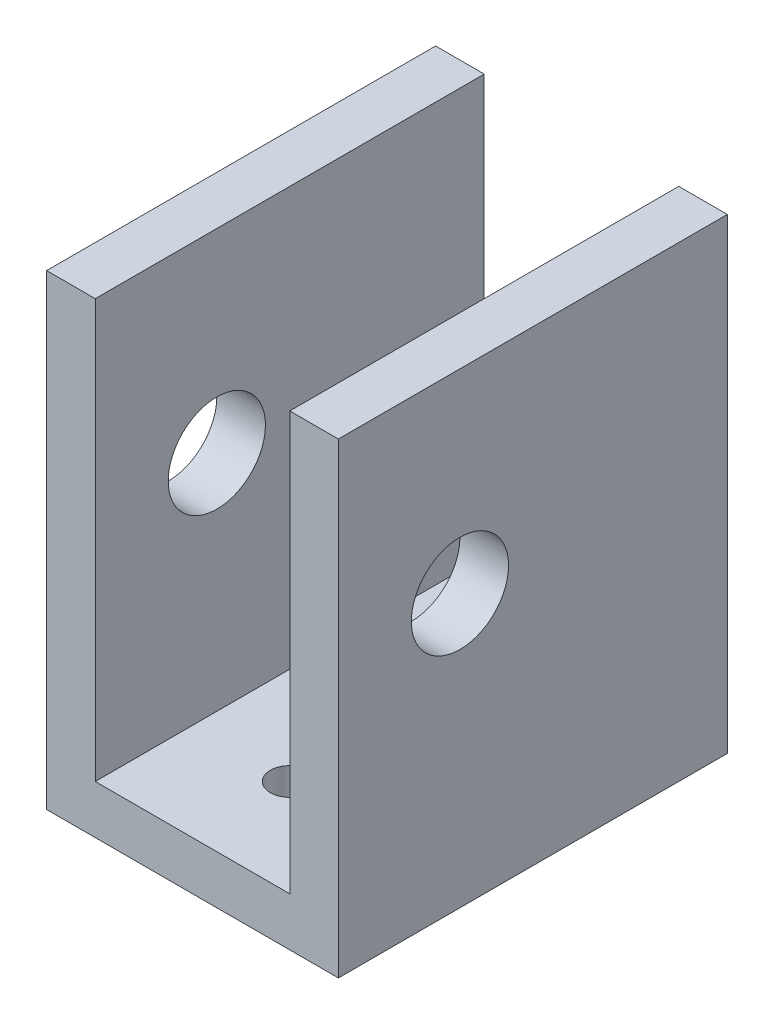
ISO-10303-21;
HEADER;
FILE_DESCRIPTION(('STEP AP214'),'2;1');
FILE_NAME('part.step','',(''),(''),'','','');
FILE_SCHEMA(('AUTOMOTIVE_DESIGN { 1 0 10303 214 1 1 1 1 }'));
ENDSEC;
DATA;
#1=APPLICATION_CONTEXT('core data for automotive mechanical design processes');
#2=APPLICATION_PROTOCOL_DEFINITION('international standard','automotive_design',2000,#1);
#3=PRODUCT_CONTEXT('',#1,'mechanical');
#4=PRODUCT('Part','Part','',(#3));
#5=PRODUCT_RELATED_PRODUCT_CATEGORY('part','',(#4));
#6=PRODUCT_DEFINITION_FORMATION('','',#4);
#7=PRODUCT_DEFINITION_CONTEXT('part definition',#1,'design');
#8=PRODUCT_DEFINITION('design','',#6,#7);
#9=PRODUCT_DEFINITION_SHAPE('','',#8);
#10=(LENGTH_UNIT() NAMED_UNIT(*) SI_UNIT(.MILLI.,.METRE.));
#11=(NAMED_UNIT(*) PLANE_ANGLE_UNIT() SI_UNIT($,.RADIAN.));
#12=(NAMED_UNIT(*) SI_UNIT($,.STERADIAN.) SOLID_ANGLE_UNIT());
#13=UNCERTAINTY_MEASURE_WITH_UNIT(LENGTH_MEASURE(1.E-05),#10,'distance_accuracy_value','');
#14=(GEOMETRIC_REPRESENTATION_CONTEXT(3) GLOBAL_UNCERTAINTY_ASSIGNED_CONTEXT((#13)) GLOBAL_UNIT_ASSIGNED_CONTEXT((#10,
#11,#12)) REPRESENTATION_CONTEXT('',''));
#15=CARTESIAN_POINT('',(0.,0.,0.));
#16=DIRECTION('',(0.,0.,1.));
#17=DIRECTION('',(1.,0.,0.));
#18=AXIS2_PLACEMENT_3D('',#15,#16,#17);
#19=CARTESIAN_POINT('',(0.,0.,12.7));
#20=DIRECTION('',(0.,0.,-1.));
#21=DIRECTION('',(-1.,0.,0.));
#22=AXIS2_PLACEMENT_3D('',#19,#20,#21);
#23=PLANE('',#22);
#24=DIRECTION('',(0.,1.,0.));
#25=VECTOR('',#24,1.);
#26=CARTESIAN_POINT('',(9.525,-19.05,12.7));
#27=LINE('',#26,#25);
#28=CARTESIAN_POINT('',(9.525,-19.05,12.7));
#29=VERTEX_POINT('',#28);
#30=CARTESIAN_POINT('',(9.525,11.43,12.7));
#31=VERTEX_POINT('',#30);
#32=EDGE_CURVE('E118',#29,#31,#27,.T.);
#33=ORIENTED_EDGE('',*,*,#32,.T.);
#34=DIRECTION('',(1.,0.,0.));
#35=VECTOR('',#34,1.);
#36=CARTESIAN_POINT('',(-9.525,11.43,12.7));
#37=LINE('',#36,#35);
#38=CARTESIAN_POINT('',(6.34999999999999,11.43,12.7));
#39=VERTEX_POINT('',#38);
#40=EDGE_CURVE('E103',#39,#31,#37,.T.);
#41=ORIENTED_EDGE('',*,*,#40,.F.);
#42=DIRECTION('',(0.,1.,0.));
#43=VECTOR('',#42,1.);
#44=CARTESIAN_POINT('',(6.35,-15.875,12.7));
#45=LINE('',#44,#43);
#46=CARTESIAN_POINT('',(6.35,-15.875,12.7));
#47=VERTEX_POINT('',#46);
#48=EDGE_CURVE('E171',#47,#39,#45,.T.);
#49=ORIENTED_EDGE('',*,*,#48,.F.);
#50=DIRECTION('',(1.,0.,0.));
#51=VECTOR('',#50,1.);
#52=CARTESIAN_POINT('',(-6.35,-15.875,12.7));
#53=LINE('',#52,#51);
#54=CARTESIAN_POINT('',(-6.35,-15.875,12.7));
#55=VERTEX_POINT('',#54);
#56=EDGE_CURVE('E176',#55,#47,#53,.T.);
#57=ORIENTED_EDGE('',*,*,#56,.F.);
#58=DIRECTION('',(0.,-1.,0.));
#59=VECTOR('',#58,1.);
#60=CARTESIAN_POINT('',(-6.35,-15.875,12.7));
#61=LINE('',#60,#59);
#62=CARTESIAN_POINT('',(-6.35,11.43,12.7));
#63=VERTEX_POINT('',#62);
#64=EDGE_CURVE('E112',#63,#55,#61,.T.);
#65=ORIENTED_EDGE('',*,*,#64,.F.);
#66=CARTESIAN_POINT('',(-9.525,11.43,12.7));
#67=VERTEX_POINT('',#66);
#68=EDGE_CURVE('E56',#67,#63,#37,.T.);
#69=ORIENTED_EDGE('',*,*,#68,.F.);
#70=DIRECTION('',(0.,-1.,0.));
#71=VECTOR('',#70,1.);
#72=CARTESIAN_POINT('',(-9.525,-19.05,12.7));
#73=LINE('',#72,#71);
#74=CARTESIAN_POINT('',(-9.525,-19.05,12.7));
#75=VERTEX_POINT('',#74);
#76=EDGE_CURVE('E109',#67,#75,#73,.T.);
#77=ORIENTED_EDGE('',*,*,#76,.T.);
#78=DIRECTION('',(1.,0.,0.));
#79=VECTOR('',#78,1.);
#80=CARTESIAN_POINT('',(-9.525,-19.05,12.7));
#81=LINE('',#80,#79);
#82=EDGE_CURVE('E117',#75,#29,#81,.T.);
#83=ORIENTED_EDGE('',*,*,#82,.T.);
#84=EDGE_LOOP('',(#33,#41,#49,#57,#65,#69,#77,#83));
#85=FACE_BOUND('',#84,.T.);
#86=ADVANCED_FACE('F32',(#85),#23,.F.);
#87=CARTESIAN_POINT('',(0.,0.,-12.7));
#88=DIRECTION('',(0.,0.,-1.));
#89=DIRECTION('',(-1.,0.,0.));
#90=AXIS2_PLACEMENT_3D('',#87,#88,#89);
#91=PLANE('',#90);
#92=DIRECTION('',(1.,0.,0.));
#93=VECTOR('',#92,1.);
#94=CARTESIAN_POINT('',(-9.525,11.43,-12.7));
#95=LINE('',#94,#93);
#96=CARTESIAN_POINT('',(6.35,11.43,-12.7));
#97=VERTEX_POINT('',#96);
#98=CARTESIAN_POINT('',(9.525,11.43,-12.7));
#99=VERTEX_POINT('',#98);
#100=EDGE_CURVE('E49',#97,#99,#95,.T.);
#101=ORIENTED_EDGE('',*,*,#100,.T.);
#102=DIRECTION('',(0.,1.,0.));
#103=VECTOR('',#102,1.);
#104=CARTESIAN_POINT('',(9.525,-19.05,-12.7));
#105=LINE('',#104,#103);
#106=CARTESIAN_POINT('',(9.525,-19.05,-12.7));
#107=VERTEX_POINT('',#106);
#108=EDGE_CURVE('E126',#107,#99,#105,.T.);
#109=ORIENTED_EDGE('',*,*,#108,.F.);
#110=DIRECTION('',(1.,0.,0.));
#111=VECTOR('',#110,1.);
#112=CARTESIAN_POINT('',(-9.525,-19.05,-12.7));
#113=LINE('',#112,#111);
#114=CARTESIAN_POINT('',(-9.525,-19.05,-12.7));
#115=VERTEX_POINT('',#114);
#116=EDGE_CURVE('E122',#115,#107,#113,.T.);
#117=ORIENTED_EDGE('',*,*,#116,.F.);
#118=DIRECTION('',(0.,-1.,0.));
#119=VECTOR('',#118,1.);
#120=CARTESIAN_POINT('',(-9.525,-19.05,-12.7));
#121=LINE('',#120,#119);
#122=CARTESIAN_POINT('',(-9.525,11.43,-12.7));
#123=VERTEX_POINT('',#122);
#124=EDGE_CURVE('E129',#123,#115,#121,.T.);
#125=ORIENTED_EDGE('',*,*,#124,.F.);
#126=CARTESIAN_POINT('',(-6.35,11.43,-12.7));
#127=VERTEX_POINT('',#126);
#128=EDGE_CURVE('E99',#123,#127,#95,.T.);
#129=ORIENTED_EDGE('',*,*,#128,.T.);
#130=DIRECTION('',(0.,-1.,0.));
#131=VECTOR('',#130,1.);
#132=CARTESIAN_POINT('',(-6.35,-15.875,-12.7));
#133=LINE('',#132,#131);
#134=CARTESIAN_POINT('',(-6.35,-15.875,-12.7));
#135=VERTEX_POINT('',#134);
#136=EDGE_CURVE('E181',#127,#135,#133,.T.);
#137=ORIENTED_EDGE('',*,*,#136,.T.);
#138=DIRECTION('',(1.,0.,0.));
#139=VECTOR('',#138,1.);
#140=CARTESIAN_POINT('',(-6.35,-15.875,-12.7));
#141=LINE('',#140,#139);
#142=CARTESIAN_POINT('',(6.35,-15.875,-12.7));
#143=VERTEX_POINT('',#142);
#144=EDGE_CURVE('E174',#135,#143,#141,.T.);
#145=ORIENTED_EDGE('',*,*,#144,.T.);
#146=DIRECTION('',(0.,1.,0.));
#147=VECTOR('',#146,1.);
#148=CARTESIAN_POINT('',(6.35,-15.875,-12.7));
#149=LINE('',#148,#147);
#150=EDGE_CURVE('E139',#143,#97,#149,.T.);
#151=ORIENTED_EDGE('',*,*,#150,.T.);
#152=EDGE_LOOP('',(#101,#109,#117,#125,#129,#137,#145,#151));
#153=FACE_BOUND('',#152,.T.);
#154=ADVANCED_FACE('F197',(#153),#91,.T.);
#155=CARTESIAN_POINT('',(9.525,-19.05,12.7));
#156=DIRECTION('',(-1.,0.,0.));
#157=DIRECTION('',(0.,0.,1.));
#158=AXIS2_PLACEMENT_3D('',#155,#156,#157);
#159=PLANE('',#158);
#160=CARTESIAN_POINT('',(9.525,-1.27,4.7625));
#161=DIRECTION('',(1.,0.,0.));
#162=DIRECTION('',(0.,0.,-1.));
#163=AXIS2_PLACEMENT_3D('',#160,#161,#162);
#164=CIRCLE('',#163,3.175);
#165=CARTESIAN_POINT('',(9.525,-1.27,1.5875));
#166=VERTEX_POINT('',#165);
#167=EDGE_CURVE('E162',#166,#166,#164,.T.);
#168=ORIENTED_EDGE('',*,*,#167,.F.);
#169=EDGE_LOOP('',(#168));
#170=FACE_BOUND('',#169,.T.);
#171=ORIENTED_EDGE('',*,*,#108,.T.);
#172=DIRECTION('',(0.,0.,-1.));
#173=VECTOR('',#172,1.);
#174=CARTESIAN_POINT('',(9.525,11.43,12.7));
#175=LINE('',#174,#173);
#176=EDGE_CURVE('E104',#31,#99,#175,.T.);
#177=ORIENTED_EDGE('',*,*,#176,.F.);
#178=ORIENTED_EDGE('',*,*,#32,.F.);
#179=DIRECTION('',(0.,0.,-1.));
#180=VECTOR('',#179,1.);
#181=CARTESIAN_POINT('',(9.525,-19.05,12.7));
#182=LINE('',#181,#180);
#183=EDGE_CURVE('E120',#29,#107,#182,.T.);
#184=ORIENTED_EDGE('',*,*,#183,.T.);
#185=EDGE_LOOP('',(#171,#177,#178,#184));
#186=FACE_BOUND('',#185,.T.);
#187=ADVANCED_FACE('F34',(#170,#186),#159,.F.);
#188=CARTESIAN_POINT('',(-9.525,-19.05,12.7));
#189=DIRECTION('',(1.,0.,0.));
#190=DIRECTION('',(0.,0.,-1.));
#191=AXIS2_PLACEMENT_3D('',#188,#189,#190);
#192=PLANE('',#191);
#193=CARTESIAN_POINT('',(-9.525,-1.27,4.7625));
#194=DIRECTION('',(1.,0.,0.));
#195=DIRECTION('',(0.,0.,-1.));
#196=AXIS2_PLACEMENT_3D('',#193,#194,#195);
#197=CIRCLE('',#196,3.175);
#198=CARTESIAN_POINT('',(-9.525,-1.27,1.5875));
#199=VERTEX_POINT('',#198);
#200=EDGE_CURVE('E144',#199,#199,#197,.T.);
#201=ORIENTED_EDGE('',*,*,#200,.T.);
#202=EDGE_LOOP('',(#201));
#203=FACE_BOUND('',#202,.T.);
#204=ORIENTED_EDGE('',*,*,#76,.F.);
#205=DIRECTION('',(0.,0.,-1.));
#206=VECTOR('',#205,1.);
#207=CARTESIAN_POINT('',(-9.525,11.43,12.7));
#208=LINE('',#207,#206);
#209=EDGE_CURVE('E96',#67,#123,#208,.T.);
#210=ORIENTED_EDGE('',*,*,#209,.T.);
#211=ORIENTED_EDGE('',*,*,#124,.T.);
#212=DIRECTION('',(0.,0.,-1.));
#213=VECTOR('',#212,1.);
#214=CARTESIAN_POINT('',(-9.525,-19.05,12.7));
#215=LINE('',#214,#213);
#216=EDGE_CURVE('E41',#75,#115,#215,.T.);
#217=ORIENTED_EDGE('',*,*,#216,.F.);
#218=EDGE_LOOP('',(#204,#210,#211,#217));
#219=FACE_BOUND('',#218,.T.);
#220=ADVANCED_FACE('F114',(#203,#219),#192,.F.);
#221=CARTESIAN_POINT('',(-9.525,-19.05,12.7));
#222=DIRECTION('',(0.,1.,0.));
#223=DIRECTION('',(0.,0.,1.));
#224=AXIS2_PLACEMENT_3D('',#221,#222,#223);
#225=PLANE('',#224);
#226=CARTESIAN_POINT('',(0.,-19.05,6.35));
#227=DIRECTION('',(0.,-1.,0.));
#228=DIRECTION('',(0.,0.,-1.));
#229=AXIS2_PLACEMENT_3D('',#226,#227,#228);
#230=CIRCLE('',#229,1.27);
#231=CARTESIAN_POINT('',(0.,-19.05,5.08));
#232=VERTEX_POINT('',#231);
#233=EDGE_CURVE('E156',#232,#232,#230,.T.);
#234=ORIENTED_EDGE('',*,*,#233,.F.);
#235=EDGE_LOOP('',(#234));
#236=FACE_BOUND('',#235,.T.);
#237=CARTESIAN_POINT('',(0.,-19.05,-6.35));
#238=DIRECTION('',(0.,-1.,0.));
#239=DIRECTION('',(0.,0.,-1.));
#240=AXIS2_PLACEMENT_3D('',#237,#238,#239);
#241=CIRCLE('',#240,1.27);
#242=CARTESIAN_POINT('',(0.,-19.05,-7.62));
#243=VERTEX_POINT('',#242);
#244=EDGE_CURVE('E147',#243,#243,#241,.T.);
#245=ORIENTED_EDGE('',*,*,#244,.F.);
#246=EDGE_LOOP('',(#245));
#247=FACE_BOUND('',#246,.T.);
#248=CARTESIAN_POINT('',(0.,-19.05,0.));
#249=DIRECTION('',(0.,-1.,0.));
#250=DIRECTION('',(0.,0.,-1.));
#251=AXIS2_PLACEMENT_3D('',#248,#249,#250);
#252=CIRCLE('',#251,2.54);
#253=CARTESIAN_POINT('',(0.,-19.05,-2.54));
#254=VERTEX_POINT('',#253);
#255=EDGE_CURVE('E140',#254,#254,#252,.T.);
#256=ORIENTED_EDGE('',*,*,#255,.F.);
#257=EDGE_LOOP('',(#256));
#258=FACE_BOUND('',#257,.T.);
#259=ORIENTED_EDGE('',*,*,#116,.T.);
#260=ORIENTED_EDGE('',*,*,#183,.F.);
#261=ORIENTED_EDGE('',*,*,#82,.F.);
#262=ORIENTED_EDGE('',*,*,#216,.T.);
#263=EDGE_LOOP('',(#259,#260,#261,#262));
#264=FACE_BOUND('',#263,.T.);
#265=ADVANCED_FACE('F201',(#236,#247,#258,#264),#225,.F.);
#266=CARTESIAN_POINT('',(6.35,-15.875,12.7));
#267=DIRECTION('',(-1.,0.,0.));
#268=DIRECTION('',(0.,0.,1.));
#269=AXIS2_PLACEMENT_3D('',#266,#267,#268);
#270=PLANE('',#269);
#271=DIRECTION('',(0.,0.,1.));
#272=VECTOR('',#271,1.);
#273=CARTESIAN_POINT('',(6.35,11.43,12.7));
#274=LINE('',#273,#272);
#275=EDGE_CURVE('E159',#97,#39,#274,.T.);
#276=ORIENTED_EDGE('',*,*,#275,.F.);
#277=ORIENTED_EDGE('',*,*,#150,.F.);
#278=DIRECTION('',(0.,0.,-1.));
#279=VECTOR('',#278,1.);
#280=CARTESIAN_POINT('',(6.35,-15.875,12.7));
#281=LINE('',#280,#279);
#282=EDGE_CURVE('E178',#47,#143,#281,.T.);
#283=ORIENTED_EDGE('',*,*,#282,.F.);
#284=ORIENTED_EDGE('',*,*,#48,.T.);
#285=EDGE_LOOP('',(#276,#277,#283,#284));
#286=FACE_BOUND('',#285,.T.);
#287=CARTESIAN_POINT('',(6.35,-1.27,4.7625));
#288=DIRECTION('',(-1.,0.,0.));
#289=DIRECTION('',(0.,0.,1.));
#290=AXIS2_PLACEMENT_3D('',#287,#288,#289);
#291=CIRCLE('',#290,3.175);
#292=CARTESIAN_POINT('',(6.35,-1.27,1.5875));
#293=VERTEX_POINT('',#292);
#294=EDGE_CURVE('E143',#293,#293,#291,.T.);
#295=ORIENTED_EDGE('',*,*,#294,.F.);
#296=EDGE_LOOP('',(#295));
#297=FACE_BOUND('',#296,.T.);
#298=ADVANCED_FACE('F210',(#286,#297),#270,.T.);
#299=CARTESIAN_POINT('',(-6.35,-15.875,12.7));
#300=DIRECTION('',(1.,0.,0.));
#301=DIRECTION('',(0.,0.,-1.));
#302=AXIS2_PLACEMENT_3D('',#299,#300,#301);
#303=PLANE('',#302);
#304=DIRECTION('',(0.,0.,-1.));
#305=VECTOR('',#304,1.);
#306=CARTESIAN_POINT('',(-6.35,11.43,12.7));
#307=LINE('',#306,#305);
#308=EDGE_CURVE('E11',#63,#127,#307,.T.);
#309=ORIENTED_EDGE('',*,*,#308,.F.);
#310=ORIENTED_EDGE('',*,*,#64,.T.);
#311=DIRECTION('',(0.,0.,-1.));
#312=VECTOR('',#311,1.);
#313=CARTESIAN_POINT('',(-6.35,-15.875,12.7));
#314=LINE('',#313,#312);
#315=EDGE_CURVE('E130',#55,#135,#314,.T.);
#316=ORIENTED_EDGE('',*,*,#315,.T.);
#317=ORIENTED_EDGE('',*,*,#136,.F.);
#318=EDGE_LOOP('',(#309,#310,#316,#317));
#319=FACE_BOUND('',#318,.T.);
#320=CARTESIAN_POINT('',(-6.35,-1.27,4.7625));
#321=DIRECTION('',(1.,0.,0.));
#322=DIRECTION('',(0.,0.,-1.));
#323=AXIS2_PLACEMENT_3D('',#320,#321,#322);
#324=CIRCLE('',#323,3.175);
#325=CARTESIAN_POINT('',(-6.35,-1.27,1.5875));
#326=VERTEX_POINT('',#325);
#327=EDGE_CURVE('E141',#326,#326,#324,.T.);
#328=ORIENTED_EDGE('',*,*,#327,.F.);
#329=EDGE_LOOP('',(#328));
#330=FACE_BOUND('',#329,.T.);
#331=ADVANCED_FACE('F191',(#319,#330),#303,.T.);
#332=CARTESIAN_POINT('',(-6.35,-15.875,12.7));
#333=DIRECTION('',(0.,1.,0.));
#334=DIRECTION('',(0.,0.,1.));
#335=AXIS2_PLACEMENT_3D('',#332,#333,#334);
#336=PLANE('',#335);
#337=CARTESIAN_POINT('',(0.,-15.875,6.35));
#338=DIRECTION('',(0.,1.,0.));
#339=DIRECTION('',(0.,0.,1.));
#340=AXIS2_PLACEMENT_3D('',#337,#338,#339);
#341=CIRCLE('',#340,1.27);
#342=CARTESIAN_POINT('',(0.,-15.875,5.08));
#343=VERTEX_POINT('',#342);
#344=EDGE_CURVE('E36',#343,#343,#341,.T.);
#345=ORIENTED_EDGE('',*,*,#344,.F.);
#346=EDGE_LOOP('',(#345));
#347=FACE_BOUND('',#346,.T.);
#348=CARTESIAN_POINT('',(0.,-15.875,-6.35));
#349=DIRECTION('',(0.,1.,0.));
#350=DIRECTION('',(0.,0.,1.));
#351=AXIS2_PLACEMENT_3D('',#348,#349,#350);
#352=CIRCLE('',#351,1.27);
#353=CARTESIAN_POINT('',(0.,-15.875,-7.62));
#354=VERTEX_POINT('',#353);
#355=EDGE_CURVE('E145',#354,#354,#352,.T.);
#356=ORIENTED_EDGE('',*,*,#355,.F.);
#357=EDGE_LOOP('',(#356));
#358=FACE_BOUND('',#357,.T.);
#359=CARTESIAN_POINT('',(0.,-15.875,0.));
#360=DIRECTION('',(0.,1.,0.));
#361=DIRECTION('',(0.,0.,1.));
#362=AXIS2_PLACEMENT_3D('',#359,#360,#361);
#363=CIRCLE('',#362,2.54);
#364=CARTESIAN_POINT('',(0.,-15.875,-2.54));
#365=VERTEX_POINT('',#364);
#366=EDGE_CURVE('E136',#365,#365,#363,.T.);
#367=ORIENTED_EDGE('',*,*,#366,.F.);
#368=EDGE_LOOP('',(#367));
#369=FACE_BOUND('',#368,.T.);
#370=ORIENTED_EDGE('',*,*,#144,.F.);
#371=ORIENTED_EDGE('',*,*,#315,.F.);
#372=ORIENTED_EDGE('',*,*,#56,.T.);
#373=ORIENTED_EDGE('',*,*,#282,.T.);
#374=EDGE_LOOP('',(#370,#371,#372,#373));
#375=FACE_BOUND('',#374,.T.);
#376=ADVANCED_FACE('F194',(#347,#358,#369,#375),#336,.T.);
#377=CARTESIAN_POINT('',(0.,57.15,0.));
#378=DIRECTION('',(0.,-1.,0.));
#379=DIRECTION('',(0.,0.,-1.));
#380=AXIS2_PLACEMENT_3D('',#377,#378,#379);
#381=CYLINDRICAL_SURFACE('',#380,2.54);
#382=CARTESIAN_POINT('',(0.,-15.875,-2.54));
#383=CARTESIAN_POINT('',(0.,-15.9080729166667,-2.54));
#384=CARTESIAN_POINT('',(0.,-15.9411458333334,-2.54));
#385=CARTESIAN_POINT('',(0.,-16.0072916666667,-2.54));
#386=CARTESIAN_POINT('',(0.,-16.0403645833333,-2.54));
#387=CARTESIAN_POINT('',(0.,-16.1065104166667,-2.54));
#388=CARTESIAN_POINT('',(0.,-16.1395833333333,-2.54));
#389=CARTESIAN_POINT('',(0.,-16.2057291666667,-2.54));
#390=CARTESIAN_POINT('',(0.,-16.2388020833333,-2.54));
#391=CARTESIAN_POINT('',(0.,-16.3049479166667,-2.54));
#392=CARTESIAN_POINT('',(0.,-16.3380208333333,-2.54));
#393=CARTESIAN_POINT('',(0.,-16.4041666666667,-2.54));
#394=CARTESIAN_POINT('',(0.,-16.4372395833333,-2.54));
#395=CARTESIAN_POINT('',(0.,-16.5033854166667,-2.54));
#396=CARTESIAN_POINT('',(0.,-16.5364583333333,-2.54));
#397=CARTESIAN_POINT('',(0.,-16.6026041666667,-2.54));
#398=CARTESIAN_POINT('',(0.,-16.6356770833333,-2.54));
#399=CARTESIAN_POINT('',(0.,-16.7018229166667,-2.54));
#400=CARTESIAN_POINT('',(0.,-16.7348958333333,-2.54));
#401=CARTESIAN_POINT('',(0.,-16.8010416666667,-2.54));
#402=CARTESIAN_POINT('',(0.,-16.8341145833333,-2.54));
#403=CARTESIAN_POINT('',(0.,-16.9002604166667,-2.54));
#404=CARTESIAN_POINT('',(0.,-16.9333333333333,-2.54));
#405=CARTESIAN_POINT('',(0.,-16.9994791666667,-2.54));
#406=CARTESIAN_POINT('',(0.,-17.0325520833333,-2.54));
#407=CARTESIAN_POINT('',(0.,-17.0986979166667,-2.54));
#408=CARTESIAN_POINT('',(0.,-17.1317708333333,-2.54));
#409=CARTESIAN_POINT('',(0.,-17.1979166666667,-2.54));
#410=CARTESIAN_POINT('',(0.,-17.2309895833333,-2.54));
#411=CARTESIAN_POINT('',(0.,-17.2971354166667,-2.54));
#412=CARTESIAN_POINT('',(0.,-17.3302083333333,-2.54));
#413=CARTESIAN_POINT('',(0.,-17.3963541666667,-2.54));
#414=CARTESIAN_POINT('',(0.,-17.4294270833333,-2.54));
#415=CARTESIAN_POINT('',(0.,-17.4955729166667,-2.54));
#416=CARTESIAN_POINT('',(0.,-17.5286458333333,-2.54));
#417=CARTESIAN_POINT('',(0.,-17.5947916666667,-2.54));
#418=CARTESIAN_POINT('',(0.,-17.6278645833333,-2.54));
#419=CARTESIAN_POINT('',(0.,-17.6940104166667,-2.54));
#420=CARTESIAN_POINT('',(0.,-17.7270833333333,-2.54));
#421=CARTESIAN_POINT('',(0.,-17.7932291666667,-2.54));
#422=CARTESIAN_POINT('',(0.,-17.8263020833333,-2.54));
#423=CARTESIAN_POINT('',(0.,-17.8924479166667,-2.54));
#424=CARTESIAN_POINT('',(0.,-17.9255208333333,-2.54));
#425=CARTESIAN_POINT('',(0.,-17.9916666666667,-2.54));
#426=CARTESIAN_POINT('',(0.,-18.0247395833333,-2.54));
#427=CARTESIAN_POINT('',(0.,-18.0908854166667,-2.54));
#428=CARTESIAN_POINT('',(0.,-18.1239583333333,-2.54));
#429=CARTESIAN_POINT('',(0.,-18.1901041666667,-2.54));
#430=CARTESIAN_POINT('',(0.,-18.2231770833333,-2.54));
#431=CARTESIAN_POINT('',(0.,-18.2893229166667,-2.54));
#432=CARTESIAN_POINT('',(0.,-18.3223958333333,-2.54));
#433=CARTESIAN_POINT('',(0.,-18.3885416666667,-2.54));
#434=CARTESIAN_POINT('',(0.,-18.4216145833333,-2.54));
#435=CARTESIAN_POINT('',(0.,-18.4877604166667,-2.54));
#436=CARTESIAN_POINT('',(0.,-18.5208333333333,-2.54));
#437=CARTESIAN_POINT('',(0.,-18.5869791666667,-2.54));
#438=CARTESIAN_POINT('',(0.,-18.6200520833333,-2.54));
#439=CARTESIAN_POINT('',(0.,-18.6861979166667,-2.54));
#440=CARTESIAN_POINT('',(0.,-18.7192708333333,-2.54));
#441=CARTESIAN_POINT('',(0.,-18.7854166666667,-2.54));
#442=CARTESIAN_POINT('',(0.,-18.8184895833333,-2.54));
#443=CARTESIAN_POINT('',(0.,-18.8846354166667,-2.54));
#444=CARTESIAN_POINT('',(0.,-18.9177083333333,-2.54));
#445=CARTESIAN_POINT('',(0.,-18.9838541666667,-2.54));
#446=CARTESIAN_POINT('',(0.,-19.0169270833333,-2.54));
#447=CARTESIAN_POINT('',(0.,-19.05,-2.54));
#448=B_SPLINE_CURVE_WITH_KNOTS('',3,(#382,#383,#384,#385,#386,#387,#388,#389,#390,#391,#392,
#393,#394,#395,#396,#397,#398,#399,#400,#401,#402,#403,#404,#405,#406,#407,#408,#409,#410,#411,
#412,#413,#414,#415,#416,#417,#418,#419,#420,#421,#422,#423,#424,#425,#426,#427,#428,#429,#430,
#431,#432,#433,#434,#435,#436,#437,#438,#439,#440,#441,#442,#443,#444,#445,#446,#447),
.UNSPECIFIED.,.F.,.F.,(4,2,2,2,2,2,2,2,2,2,2,2,2,2,2,2,2,2,2,2,2,2,2,2,2,2,2,2,2,2,2,2,4),(0.,
0.0992187500000047,0.198437499999995,0.29765625,0.396874999999991,0.496093749999996,0.5953125,
0.694531249999991,0.793749999999996,0.892968750000001,0.992187499999991,1.09140625,1.190625,
1.28984374999999,1.3890625,1.48828124999999,1.58749999999999,1.68671875,1.78593749999999,
1.88515624999999,1.98437499999998,2.08359374999999,2.18281249999999,2.28203124999998,
2.38124999999999,2.48046874999999,2.57968749999998,2.67890624999999,2.77812499999999,
2.87734374999998,2.97656249999999,3.07578124999998,3.17499999999998),.UNSPECIFIED.);
#449=EDGE_CURVE('BSEAM246',#365,#254,#448,.T.);
#450=ORIENTED_EDGE('',*,*,#366,.T.);
#451=ORIENTED_EDGE('',*,*,#255,.T.);
#452=ORIENTED_EDGE('',*,*,#449,.T.);
#453=ORIENTED_EDGE('',*,*,#449,.F.);
#454=EDGE_LOOP('',(#450,#452,#451,#453));
#455=FACE_BOUND('',#454,.T.);
#456=ADVANCED_FACE('F246',(#455),#381,.F.);
#457=CARTESIAN_POINT('',(-9.525,-1.27,4.7625));
#458=DIRECTION('',(1.,0.,0.));
#459=DIRECTION('',(0.,0.,-1.));
#460=AXIS2_PLACEMENT_3D('',#457,#458,#459);
#461=CYLINDRICAL_SURFACE('',#460,3.175);
#462=CARTESIAN_POINT('',(-6.35,-1.27,1.5875));
#463=CARTESIAN_POINT('',(-6.38307291666667,-1.27,1.5875));
#464=CARTESIAN_POINT('',(-6.41614583333333,-1.27,1.5875));
#465=CARTESIAN_POINT('',(-6.48229166666667,-1.27,1.5875));
#466=CARTESIAN_POINT('',(-6.51536458333334,-1.27,1.5875));
#467=CARTESIAN_POINT('',(-6.58151041666667,-1.27,1.5875));
#468=CARTESIAN_POINT('',(-6.61458333333333,-1.27,1.5875));
#469=CARTESIAN_POINT('',(-6.68072916666667,-1.27,1.5875));
#470=CARTESIAN_POINT('',(-6.71380208333333,-1.27,1.5875));
#471=CARTESIAN_POINT('',(-6.77994791666667,-1.27,1.5875));
#472=CARTESIAN_POINT('',(-6.81302083333333,-1.27,1.5875));
#473=CARTESIAN_POINT('',(-6.87916666666667,-1.27,1.5875));
#474=CARTESIAN_POINT('',(-6.91223958333333,-1.27,1.5875));
#475=CARTESIAN_POINT('',(-6.97838541666667,-1.27,1.5875));
#476=CARTESIAN_POINT('',(-7.01145833333333,-1.27,1.5875));
#477=CARTESIAN_POINT('',(-7.07760416666667,-1.27,1.5875));
#478=CARTESIAN_POINT('',(-7.11067708333333,-1.27,1.5875));
#479=CARTESIAN_POINT('',(-7.17682291666667,-1.27,1.5875));
#480=CARTESIAN_POINT('',(-7.20989583333333,-1.27,1.5875));
#481=CARTESIAN_POINT('',(-7.27604166666667,-1.27,1.5875));
#482=CARTESIAN_POINT('',(-7.30911458333333,-1.27,1.5875));
#483=CARTESIAN_POINT('',(-7.37526041666667,-1.27,1.5875));
#484=CARTESIAN_POINT('',(-7.40833333333333,-1.27,1.5875));
#485=CARTESIAN_POINT('',(-7.47447916666667,-1.27,1.5875));
#486=CARTESIAN_POINT('',(-7.50755208333333,-1.27,1.5875));
#487=CARTESIAN_POINT('',(-7.57369791666667,-1.27,1.5875));
#488=CARTESIAN_POINT('',(-7.60677083333333,-1.27,1.5875));
#489=CARTESIAN_POINT('',(-7.67291666666667,-1.27,1.5875));
#490=CARTESIAN_POINT('',(-7.70598958333333,-1.27,1.5875));
#491=CARTESIAN_POINT('',(-7.77213541666667,-1.27,1.5875));
#492=CARTESIAN_POINT('',(-7.80520833333333,-1.27,1.5875));
#493=CARTESIAN_POINT('',(-7.87135416666667,-1.27,1.5875));
#494=CARTESIAN_POINT('',(-7.90442708333333,-1.27,1.5875));
#495=CARTESIAN_POINT('',(-7.97057291666667,-1.27,1.5875));
#496=CARTESIAN_POINT('',(-8.00364583333334,-1.27,1.5875));
#497=CARTESIAN_POINT('',(-8.06979166666667,-1.27,1.5875));
#498=CARTESIAN_POINT('',(-8.10286458333333,-1.27,1.5875));
#499=CARTESIAN_POINT('',(-8.16901041666667,-1.27,1.5875));
#500=CARTESIAN_POINT('',(-8.20208333333333,-1.27,1.5875));
#501=CARTESIAN_POINT('',(-8.26822916666667,-1.27,1.5875));
#502=CARTESIAN_POINT('',(-8.30130208333333,-1.27,1.5875));
#503=CARTESIAN_POINT('',(-8.36744791666667,-1.27,1.5875));
#504=CARTESIAN_POINT('',(-8.40052083333333,-1.27,1.5875));
#505=CARTESIAN_POINT('',(-8.46666666666667,-1.27,1.5875));
#506=CARTESIAN_POINT('',(-8.49973958333333,-1.27,1.5875));
#507=CARTESIAN_POINT('',(-8.56588541666667,-1.27,1.5875));
#508=CARTESIAN_POINT('',(-8.59895833333333,-1.27,1.5875));
#509=CARTESIAN_POINT('',(-8.66510416666667,-1.27,1.5875));
#510=CARTESIAN_POINT('',(-8.69817708333333,-1.27,1.5875));
#511=CARTESIAN_POINT('',(-8.76432291666667,-1.27,1.5875));
#512=CARTESIAN_POINT('',(-8.79739583333333,-1.27,1.5875));
#513=CARTESIAN_POINT('',(-8.86354166666667,-1.27,1.5875));
#514=CARTESIAN_POINT('',(-8.89661458333333,-1.27,1.5875));
#515=CARTESIAN_POINT('',(-8.96276041666667,-1.27,1.5875));
#516=CARTESIAN_POINT('',(-8.99583333333333,-1.27,1.5875));
#517=CARTESIAN_POINT('',(-9.06197916666667,-1.27,1.5875));
#518=CARTESIAN_POINT('',(-9.09505208333333,-1.27,1.5875));
#519=CARTESIAN_POINT('',(-9.16119791666667,-1.27,1.5875));
#520=CARTESIAN_POINT('',(-9.19427083333333,-1.27,1.5875));
#521=CARTESIAN_POINT('',(-9.26041666666667,-1.27,1.5875));
#522=CARTESIAN_POINT('',(-9.29348958333333,-1.27,1.5875));
#523=CARTESIAN_POINT('',(-9.35963541666667,-1.27,1.5875));
#524=CARTESIAN_POINT('',(-9.39270833333333,-1.27,1.5875));
#525=CARTESIAN_POINT('',(-9.45885416666667,-1.27,1.5875));
#526=CARTESIAN_POINT('',(-9.49192708333333,-1.27,1.5875));
#527=CARTESIAN_POINT('',(-9.525,-1.27,1.5875));
#528=B_SPLINE_CURVE_WITH_KNOTS('',3,(#462,#463,#464,#465,#466,#467,#468,#469,#470,#471,#472,
#473,#474,#475,#476,#477,#478,#479,#480,#481,#482,#483,#484,#485,#486,#487,#488,#489,#490,#491,
#492,#493,#494,#495,#496,#497,#498,#499,#500,#501,#502,#503,#504,#505,#506,#507,#508,#509,#510,
#511,#512,#513,#514,#515,#516,#517,#518,#519,#520,#521,#522,#523,#524,#525,#526,#527),
.UNSPECIFIED.,.F.,.F.,(4,2,2,2,2,2,2,2,2,2,2,2,2,2,2,2,2,2,2,2,2,2,2,2,2,2,2,2,2,2,2,2,4),(0.,
0.0992187500000004,0.198437500000001,0.29765625,0.396875,0.49609375,0.5953125,0.69453125,
0.793749999999999,0.892968750000001,0.9921875,1.09140625,1.190625,1.28984375,1.3890625,
1.48828125,1.5875,1.68671875,1.7859375,1.88515625,1.984375,2.08359375,2.1828125,2.28203125,
2.38125,2.48046875,2.5796875,2.67890625,2.778125,2.87734375,2.9765625,3.07578125,3.175),.UNSPECIFIED.);
#529=EDGE_CURVE('BSEAM219',#326,#199,#528,.T.);
#530=ORIENTED_EDGE('',*,*,#327,.T.);
#531=ORIENTED_EDGE('',*,*,#200,.F.);
#532=ORIENTED_EDGE('',*,*,#529,.T.);
#533=ORIENTED_EDGE('',*,*,#529,.F.);
#534=EDGE_LOOP('',(#530,#532,#531,#533));
#535=FACE_BOUND('',#534,.T.);
#536=ADVANCED_FACE('F219',(#535),#461,.F.);
#537=CARTESIAN_POINT('',(6.35,-1.27,1.5875));
#538=CARTESIAN_POINT('',(6.38307291666667,-1.27,1.5875));
#539=CARTESIAN_POINT('',(6.41614583333333,-1.27,1.5875));
#540=CARTESIAN_POINT('',(6.48229166666667,-1.27,1.5875));
#541=CARTESIAN_POINT('',(6.51536458333333,-1.27,1.5875));
#542=CARTESIAN_POINT('',(6.58151041666666,-1.27,1.5875));
#543=CARTESIAN_POINT('',(6.61458333333333,-1.27,1.5875));
#544=CARTESIAN_POINT('',(6.68072916666667,-1.27,1.5875));
#545=CARTESIAN_POINT('',(6.71380208333333,-1.27,1.5875));
#546=CARTESIAN_POINT('',(6.77994791666667,-1.27,1.5875));
#547=CARTESIAN_POINT('',(6.81302083333333,-1.27,1.5875));
#548=CARTESIAN_POINT('',(6.87916666666666,-1.27,1.5875));
#549=CARTESIAN_POINT('',(6.91223958333333,-1.27,1.5875));
#550=CARTESIAN_POINT('',(6.97838541666667,-1.27,1.5875));
#551=CARTESIAN_POINT('',(7.01145833333333,-1.27,1.5875));
#552=CARTESIAN_POINT('',(7.07760416666667,-1.27,1.5875));
#553=CARTESIAN_POINT('',(7.11067708333333,-1.27,1.5875));
#554=CARTESIAN_POINT('',(7.17682291666667,-1.27,1.5875));
#555=CARTESIAN_POINT('',(7.20989583333333,-1.27,1.5875));
#556=CARTESIAN_POINT('',(7.27604166666667,-1.27,1.5875));
#557=CARTESIAN_POINT('',(7.30911458333333,-1.27,1.5875));
#558=CARTESIAN_POINT('',(7.37526041666667,-1.27,1.5875));
#559=CARTESIAN_POINT('',(7.40833333333333,-1.27,1.5875));
#560=CARTESIAN_POINT('',(7.47447916666667,-1.27,1.5875));
#561=CARTESIAN_POINT('',(7.50755208333333,-1.27,1.5875));
#562=CARTESIAN_POINT('',(7.57369791666667,-1.27,1.5875));
#563=CARTESIAN_POINT('',(7.60677083333333,-1.27,1.5875));
#564=CARTESIAN_POINT('',(7.67291666666667,-1.27,1.5875));
#565=CARTESIAN_POINT('',(7.70598958333333,-1.27,1.5875));
#566=CARTESIAN_POINT('',(7.77213541666667,-1.27,1.5875));
#567=CARTESIAN_POINT('',(7.80520833333333,-1.27,1.5875));
#568=CARTESIAN_POINT('',(7.87135416666667,-1.27,1.5875));
#569=CARTESIAN_POINT('',(7.90442708333333,-1.27,1.5875));
#570=CARTESIAN_POINT('',(7.97057291666667,-1.27,1.5875));
#571=CARTESIAN_POINT('',(8.00364583333334,-1.27,1.5875));
#572=CARTESIAN_POINT('',(8.06979166666667,-1.27,1.5875));
#573=CARTESIAN_POINT('',(8.10286458333333,-1.27,1.5875));
#574=CARTESIAN_POINT('',(8.16901041666667,-1.27,1.5875));
#575=CARTESIAN_POINT('',(8.20208333333333,-1.27,1.5875));
#576=CARTESIAN_POINT('',(8.26822916666667,-1.27,1.5875));
#577=CARTESIAN_POINT('',(8.30130208333333,-1.27,1.5875));
#578=CARTESIAN_POINT('',(8.36744791666667,-1.27,1.5875));
#579=CARTESIAN_POINT('',(8.40052083333333,-1.27,1.5875));
#580=CARTESIAN_POINT('',(8.46666666666667,-1.27,1.5875));
#581=CARTESIAN_POINT('',(8.49973958333333,-1.27,1.5875));
#582=CARTESIAN_POINT('',(8.56588541666667,-1.27,1.5875));
#583=CARTESIAN_POINT('',(8.59895833333334,-1.27,1.5875));
#584=CARTESIAN_POINT('',(8.66510416666667,-1.27,1.5875));
#585=CARTESIAN_POINT('',(8.69817708333333,-1.27,1.5875));
#586=CARTESIAN_POINT('',(8.76432291666667,-1.27,1.5875));
#587=CARTESIAN_POINT('',(8.79739583333333,-1.27,1.5875));
#588=CARTESIAN_POINT('',(8.86354166666667,-1.27,1.5875));
#589=CARTESIAN_POINT('',(8.89661458333333,-1.27,1.5875));
#590=CARTESIAN_POINT('',(8.96276041666667,-1.27,1.5875));
#591=CARTESIAN_POINT('',(8.99583333333333,-1.27,1.5875));
#592=CARTESIAN_POINT('',(9.06197916666667,-1.27,1.5875));
#593=CARTESIAN_POINT('',(9.09505208333333,-1.27,1.5875));
#594=CARTESIAN_POINT('',(9.16119791666667,-1.27,1.5875));
#595=CARTESIAN_POINT('',(9.19427083333334,-1.27,1.5875));
#596=CARTESIAN_POINT('',(9.26041666666667,-1.27,1.5875));
#597=CARTESIAN_POINT('',(9.29348958333334,-1.27,1.5875));
#598=CARTESIAN_POINT('',(9.35963541666667,-1.27,1.5875));
#599=CARTESIAN_POINT('',(9.39270833333333,-1.27,1.5875));
#600=CARTESIAN_POINT('',(9.45885416666667,-1.27,1.5875));
#601=CARTESIAN_POINT('',(9.49192708333334,-1.27,1.5875));
#602=CARTESIAN_POINT('',(9.525,-1.27,1.5875));
#603=B_SPLINE_CURVE_WITH_KNOTS('',3,(#537,#538,#539,#540,#541,#542,#543,#544,#545,#546,#547,
#548,#549,#550,#551,#552,#553,#554,#555,#556,#557,#558,#559,#560,#561,#562,#563,#564,#565,#566,
#567,#568,#569,#570,#571,#572,#573,#574,#575,#576,#577,#578,#579,#580,#581,#582,#583,#584,#585,
#586,#587,#588,#589,#590,#591,#592,#593,#594,#595,#596,#597,#598,#599,#600,#601,#602),
.UNSPECIFIED.,.F.,.F.,(4,2,2,2,2,2,2,2,2,2,2,2,2,2,2,2,2,2,2,2,2,2,2,2,2,2,2,2,2,2,2,2,4),(0.,
0.0992187500000012,0.198437499999999,0.29765625,0.396875000000001,0.496093749999999,0.5953125,
0.694531250000002,0.793750000000003,0.892968750000001,0.992187500000002,1.09140625,1.190625,
1.28984375,1.3890625,1.48828125,1.5875,1.68671875,1.7859375,1.88515625,1.984375,2.08359375,
2.1828125,2.28203125,2.38125,2.48046875,2.5796875,2.67890625,2.778125,2.87734375,
2.97656250000001,3.07578125,3.175),.UNSPECIFIED.);
#604=EDGE_CURVE('BSEAM216',#293,#166,#603,.T.);
#605=ORIENTED_EDGE('',*,*,#294,.T.);
#606=ORIENTED_EDGE('',*,*,#167,.T.);
#607=ORIENTED_EDGE('',*,*,#604,.T.);
#608=ORIENTED_EDGE('',*,*,#604,.F.);
#609=EDGE_LOOP('',(#605,#607,#606,#608));
#610=FACE_BOUND('',#609,.T.);
#611=ADVANCED_FACE('F216',(#610),#461,.F.);
#612=CARTESIAN_POINT('',(-9.525,11.43,12.7));
#613=DIRECTION('',(0.,-1.,0.));
#614=DIRECTION('',(0.,0.,-1.));
#615=AXIS2_PLACEMENT_3D('',#612,#613,#614);
#616=PLANE('',#615);
#617=ORIENTED_EDGE('',*,*,#308,.T.);
#618=ORIENTED_EDGE('',*,*,#128,.F.);
#619=ORIENTED_EDGE('',*,*,#209,.F.);
#620=ORIENTED_EDGE('',*,*,#68,.T.);
#621=EDGE_LOOP('',(#617,#618,#619,#620));
#622=FACE_BOUND('',#621,.T.);
#623=ADVANCED_FACE('F97',(#622),#616,.F.);
#624=ORIENTED_EDGE('',*,*,#275,.T.);
#625=ORIENTED_EDGE('',*,*,#40,.T.);
#626=ORIENTED_EDGE('',*,*,#176,.T.);
#627=ORIENTED_EDGE('',*,*,#100,.F.);
#628=EDGE_LOOP('',(#624,#625,#626,#627));
#629=FACE_BOUND('',#628,.T.);
#630=ADVANCED_FACE('F208',(#629),#616,.F.);
#631=CARTESIAN_POINT('',(0.,11.43,-6.35));
#632=DIRECTION('',(0.,-1.,0.));
#633=DIRECTION('',(0.,0.,-1.));
#634=AXIS2_PLACEMENT_3D('',#631,#632,#633);
#635=CYLINDRICAL_SURFACE('',#634,1.27);
#636=CARTESIAN_POINT('',(0.,-15.875,-7.62));
#637=CARTESIAN_POINT('',(0.,-15.9080729166667,-7.62));
#638=CARTESIAN_POINT('',(0.,-15.9411458333333,-7.62));
#639=CARTESIAN_POINT('',(0.,-16.0072916666667,-7.62));
#640=CARTESIAN_POINT('',(0.,-16.0403645833333,-7.62));
#641=CARTESIAN_POINT('',(0.,-16.1065104166667,-7.62));
#642=CARTESIAN_POINT('',(0.,-16.1395833333333,-7.62));
#643=CARTESIAN_POINT('',(0.,-16.2057291666667,-7.62));
#644=CARTESIAN_POINT('',(0.,-16.2388020833333,-7.62));
#645=CARTESIAN_POINT('',(0.,-16.3049479166667,-7.62));
#646=CARTESIAN_POINT('',(0.,-16.3380208333333,-7.62));
#647=CARTESIAN_POINT('',(0.,-16.4041666666667,-7.62));
#648=CARTESIAN_POINT('',(0.,-16.4372395833333,-7.62));
#649=CARTESIAN_POINT('',(0.,-16.5033854166667,-7.62));
#650=CARTESIAN_POINT('',(0.,-16.5364583333333,-7.62));
#651=CARTESIAN_POINT('',(0.,-16.6026041666667,-7.62));
#652=CARTESIAN_POINT('',(0.,-16.6356770833333,-7.62));
#653=CARTESIAN_POINT('',(0.,-16.7018229166667,-7.62));
#654=CARTESIAN_POINT('',(0.,-16.7348958333333,-7.62));
#655=CARTESIAN_POINT('',(0.,-16.8010416666667,-7.62));
#656=CARTESIAN_POINT('',(0.,-16.8341145833333,-7.62));
#657=CARTESIAN_POINT('',(0.,-16.9002604166667,-7.62));
#658=CARTESIAN_POINT('',(0.,-16.9333333333333,-7.62));
#659=CARTESIAN_POINT('',(0.,-16.9994791666667,-7.62));
#660=CARTESIAN_POINT('',(0.,-17.0325520833333,-7.62));
#661=CARTESIAN_POINT('',(0.,-17.0986979166667,-7.62));
#662=CARTESIAN_POINT('',(0.,-17.1317708333333,-7.62));
#663=CARTESIAN_POINT('',(0.,-17.1979166666667,-7.62));
#664=CARTESIAN_POINT('',(0.,-17.2309895833333,-7.62));
#665=CARTESIAN_POINT('',(0.,-17.2971354166667,-7.62));
#666=CARTESIAN_POINT('',(0.,-17.3302083333333,-7.62));
#667=CARTESIAN_POINT('',(0.,-17.3963541666667,-7.62));
#668=CARTESIAN_POINT('',(0.,-17.4294270833333,-7.62));
#669=CARTESIAN_POINT('',(0.,-17.4955729166667,-7.62));
#670=CARTESIAN_POINT('',(0.,-17.5286458333333,-7.62));
#671=CARTESIAN_POINT('',(0.,-17.5947916666667,-7.62));
#672=CARTESIAN_POINT('',(0.,-17.6278645833333,-7.62));
#673=CARTESIAN_POINT('',(0.,-17.6940104166667,-7.62));
#674=CARTESIAN_POINT('',(0.,-17.7270833333333,-7.62));
#675=CARTESIAN_POINT('',(0.,-17.7932291666667,-7.62));
#676=CARTESIAN_POINT('',(0.,-17.8263020833333,-7.62));
#677=CARTESIAN_POINT('',(0.,-17.8924479166667,-7.62));
#678=CARTESIAN_POINT('',(0.,-17.9255208333333,-7.62));
#679=CARTESIAN_POINT('',(0.,-17.9916666666667,-7.62));
#680=CARTESIAN_POINT('',(0.,-18.0247395833333,-7.62));
#681=CARTESIAN_POINT('',(0.,-18.0908854166667,-7.62));
#682=CARTESIAN_POINT('',(0.,-18.1239583333333,-7.62));
#683=CARTESIAN_POINT('',(0.,-18.1901041666667,-7.62));
#684=CARTESIAN_POINT('',(0.,-18.2231770833333,-7.62));
#685=CARTESIAN_POINT('',(0.,-18.2893229166667,-7.62));
#686=CARTESIAN_POINT('',(0.,-18.3223958333333,-7.62));
#687=CARTESIAN_POINT('',(0.,-18.3885416666667,-7.62));
#688=CARTESIAN_POINT('',(0.,-18.4216145833333,-7.62));
#689=CARTESIAN_POINT('',(0.,-18.4877604166667,-7.62));
#690=CARTESIAN_POINT('',(0.,-18.5208333333333,-7.62));
#691=CARTESIAN_POINT('',(0.,-18.5869791666667,-7.62));
#692=CARTESIAN_POINT('',(0.,-18.6200520833333,-7.62));
#693=CARTESIAN_POINT('',(0.,-18.6861979166667,-7.62));
#694=CARTESIAN_POINT('',(0.,-18.7192708333333,-7.62));
#695=CARTESIAN_POINT('',(0.,-18.7854166666667,-7.62));
#696=CARTESIAN_POINT('',(0.,-18.8184895833333,-7.62));
#697=CARTESIAN_POINT('',(0.,-18.8846354166667,-7.62));
#698=CARTESIAN_POINT('',(0.,-18.9177083333333,-7.62));
#699=CARTESIAN_POINT('',(0.,-18.9838541666667,-7.62));
#700=CARTESIAN_POINT('',(0.,-19.0169270833333,-7.62));
#701=CARTESIAN_POINT('',(0.,-19.05,-7.62));
#702=B_SPLINE_CURVE_WITH_KNOTS('',3,(#636,#637,#638,#639,#640,#641,#642,#643,#644,#645,#646,
#647,#648,#649,#650,#651,#652,#653,#654,#655,#656,#657,#658,#659,#660,#661,#662,#663,#664,#665,
#666,#667,#668,#669,#670,#671,#672,#673,#674,#675,#676,#677,#678,#679,#680,#681,#682,#683,#684,
#685,#686,#687,#688,#689,#690,#691,#692,#693,#694,#695,#696,#697,#698,#699,#700,#701),
.UNSPECIFIED.,.F.,.F.,(4,2,2,2,2,2,2,2,2,2,2,2,2,2,2,2,2,2,2,2,2,2,2,2,2,2,2,2,2,2,2,2,4),(0.,
0.0992187500000012,0.198437499999999,0.29765625,0.396875000000001,0.496093749999999,0.5953125,
0.694531250000002,0.793750000000003,0.892968750000001,0.992187500000002,1.09140625,1.190625,
1.28984375,1.3890625,1.48828125,1.5875,1.68671875,1.7859375,1.88515625,1.984375,2.08359375,
2.1828125,2.28203125,2.38125,2.48046875,2.5796875,2.67890625,2.778125,2.87734375,
2.97656250000001,3.07578125,3.175),.UNSPECIFIED.);
#703=EDGE_CURVE('BSEAM277',#354,#243,#702,.T.);
#704=ORIENTED_EDGE('',*,*,#355,.T.);
#705=ORIENTED_EDGE('',*,*,#244,.T.);
#706=ORIENTED_EDGE('',*,*,#703,.T.);
#707=ORIENTED_EDGE('',*,*,#703,.F.);
#708=EDGE_LOOP('',(#704,#706,#705,#707));
#709=FACE_BOUND('',#708,.T.);
#710=ADVANCED_FACE('F277',(#709),#635,.F.);
#711=CARTESIAN_POINT('',(0.,11.43,6.35));
#712=DIRECTION('',(0.,-1.,0.));
#713=DIRECTION('',(0.,0.,-1.));
#714=AXIS2_PLACEMENT_3D('',#711,#712,#713);
#715=CYLINDRICAL_SURFACE('',#714,1.27);
#716=CARTESIAN_POINT('',(0.,-15.875,5.08));
#717=CARTESIAN_POINT('',(0.,-15.9080729166667,5.08));
#718=CARTESIAN_POINT('',(0.,-15.9411458333333,5.08));
#719=CARTESIAN_POINT('',(0.,-16.0072916666667,5.08));
#720=CARTESIAN_POINT('',(0.,-16.0403645833333,5.08));
#721=CARTESIAN_POINT('',(0.,-16.1065104166667,5.08));
#722=CARTESIAN_POINT('',(0.,-16.1395833333333,5.08));
#723=CARTESIAN_POINT('',(0.,-16.2057291666667,5.08));
#724=CARTESIAN_POINT('',(0.,-16.2388020833333,5.08));
#725=CARTESIAN_POINT('',(0.,-16.3049479166667,5.08));
#726=CARTESIAN_POINT('',(0.,-16.3380208333333,5.08));
#727=CARTESIAN_POINT('',(0.,-16.4041666666667,5.08));
#728=CARTESIAN_POINT('',(0.,-16.4372395833333,5.08));
#729=CARTESIAN_POINT('',(0.,-16.5033854166667,5.08));
#730=CARTESIAN_POINT('',(0.,-16.5364583333333,5.08));
#731=CARTESIAN_POINT('',(0.,-16.6026041666667,5.08));
#732=CARTESIAN_POINT('',(0.,-16.6356770833333,5.08));
#733=CARTESIAN_POINT('',(0.,-16.7018229166667,5.08));
#734=CARTESIAN_POINT('',(0.,-16.7348958333333,5.08));
#735=CARTESIAN_POINT('',(0.,-16.8010416666667,5.08));
#736=CARTESIAN_POINT('',(0.,-16.8341145833333,5.08));
#737=CARTESIAN_POINT('',(0.,-16.9002604166667,5.08));
#738=CARTESIAN_POINT('',(0.,-16.9333333333333,5.08));
#739=CARTESIAN_POINT('',(0.,-16.9994791666667,5.08));
#740=CARTESIAN_POINT('',(0.,-17.0325520833333,5.08));
#741=CARTESIAN_POINT('',(0.,-17.0986979166667,5.08));
#742=CARTESIAN_POINT('',(0.,-17.1317708333333,5.08));
#743=CARTESIAN_POINT('',(0.,-17.1979166666667,5.08));
#744=CARTESIAN_POINT('',(0.,-17.2309895833333,5.08));
#745=CARTESIAN_POINT('',(0.,-17.2971354166667,5.08));
#746=CARTESIAN_POINT('',(0.,-17.3302083333333,5.08));
#747=CARTESIAN_POINT('',(0.,-17.3963541666667,5.08));
#748=CARTESIAN_POINT('',(0.,-17.4294270833333,5.08));
#749=CARTESIAN_POINT('',(0.,-17.4955729166667,5.08));
#750=CARTESIAN_POINT('',(0.,-17.5286458333333,5.08));
#751=CARTESIAN_POINT('',(0.,-17.5947916666667,5.08));
#752=CARTESIAN_POINT('',(0.,-17.6278645833333,5.08));
#753=CARTESIAN_POINT('',(0.,-17.6940104166667,5.08));
#754=CARTESIAN_POINT('',(0.,-17.7270833333333,5.08));
#755=CARTESIAN_POINT('',(0.,-17.7932291666667,5.08));
#756=CARTESIAN_POINT('',(0.,-17.8263020833333,5.08));
#757=CARTESIAN_POINT('',(0.,-17.8924479166667,5.08));
#758=CARTESIAN_POINT('',(0.,-17.9255208333333,5.08));
#759=CARTESIAN_POINT('',(0.,-17.9916666666667,5.08));
#760=CARTESIAN_POINT('',(0.,-18.0247395833333,5.08));
#761=CARTESIAN_POINT('',(0.,-18.0908854166667,5.08));
#762=CARTESIAN_POINT('',(0.,-18.1239583333333,5.08));
#763=CARTESIAN_POINT('',(0.,-18.1901041666667,5.08));
#764=CARTESIAN_POINT('',(0.,-18.2231770833333,5.08));
#765=CARTESIAN_POINT('',(0.,-18.2893229166667,5.08));
#766=CARTESIAN_POINT('',(0.,-18.3223958333333,5.08));
#767=CARTESIAN_POINT('',(0.,-18.3885416666667,5.08));
#768=CARTESIAN_POINT('',(0.,-18.4216145833333,5.08));
#769=CARTESIAN_POINT('',(0.,-18.4877604166667,5.08));
#770=CARTESIAN_POINT('',(0.,-18.5208333333333,5.08));
#771=CARTESIAN_POINT('',(0.,-18.5869791666667,5.08));
#772=CARTESIAN_POINT('',(0.,-18.6200520833333,5.08));
#773=CARTESIAN_POINT('',(0.,-18.6861979166667,5.08));
#774=CARTESIAN_POINT('',(0.,-18.7192708333333,5.08));
#775=CARTESIAN_POINT('',(0.,-18.7854166666667,5.08));
#776=CARTESIAN_POINT('',(0.,-18.8184895833333,5.08));
#777=CARTESIAN_POINT('',(0.,-18.8846354166667,5.08));
#778=CARTESIAN_POINT('',(0.,-18.9177083333333,5.08));
#779=CARTESIAN_POINT('',(0.,-18.9838541666667,5.08));
#780=CARTESIAN_POINT('',(0.,-19.0169270833333,5.08));
#781=CARTESIAN_POINT('',(0.,-19.05,5.08));
#782=B_SPLINE_CURVE_WITH_KNOTS('',3,(#716,#717,#718,#719,#720,#721,#722,#723,#724,#725,#726,
#727,#728,#729,#730,#731,#732,#733,#734,#735,#736,#737,#738,#739,#740,#741,#742,#743,#744,#745,
#746,#747,#748,#749,#750,#751,#752,#753,#754,#755,#756,#757,#758,#759,#760,#761,#762,#763,#764,
#765,#766,#767,#768,#769,#770,#771,#772,#773,#774,#775,#776,#777,#778,#779,#780,#781),
.UNSPECIFIED.,.F.,.F.,(4,2,2,2,2,2,2,2,2,2,2,2,2,2,2,2,2,2,2,2,2,2,2,2,2,2,2,2,2,2,2,2,4),(0.,
0.0992187500000012,0.198437499999999,0.29765625,0.396875000000001,0.496093749999999,0.5953125,
0.694531250000002,0.793750000000003,0.892968750000001,0.992187500000002,1.09140625,1.190625,
1.28984375,1.3890625,1.48828125,1.5875,1.68671875,1.7859375,1.88515625,1.984375,2.08359375,
2.1828125,2.28203125,2.38125,2.48046875,2.5796875,2.67890625,2.778125,2.87734375,
2.97656250000001,3.07578125,3.175),.UNSPECIFIED.);
#783=EDGE_CURVE('BSEAM282',#343,#232,#782,.T.);
#784=ORIENTED_EDGE('',*,*,#344,.T.);
#785=ORIENTED_EDGE('',*,*,#233,.T.);
#786=ORIENTED_EDGE('',*,*,#783,.T.);
#787=ORIENTED_EDGE('',*,*,#783,.F.);
#788=EDGE_LOOP('',(#784,#786,#785,#787));
#789=FACE_BOUND('',#788,.T.);
#790=ADVANCED_FACE('F282',(#789),#715,.F.);
#791=CLOSED_SHELL('',(#86,#154,#187,#220,#265,#298,#331,#376,#456,#536,#611,#623,#630,#710,#790));
#792=MANIFOLD_SOLID_BREP('B2',#791);
#793=ADVANCED_BREP_SHAPE_REPRESENTATION('',(#18,#792),#14);
#794=SHAPE_DEFINITION_REPRESENTATION(#9,#793);
ENDSEC;
END-ISO-10303-21;
